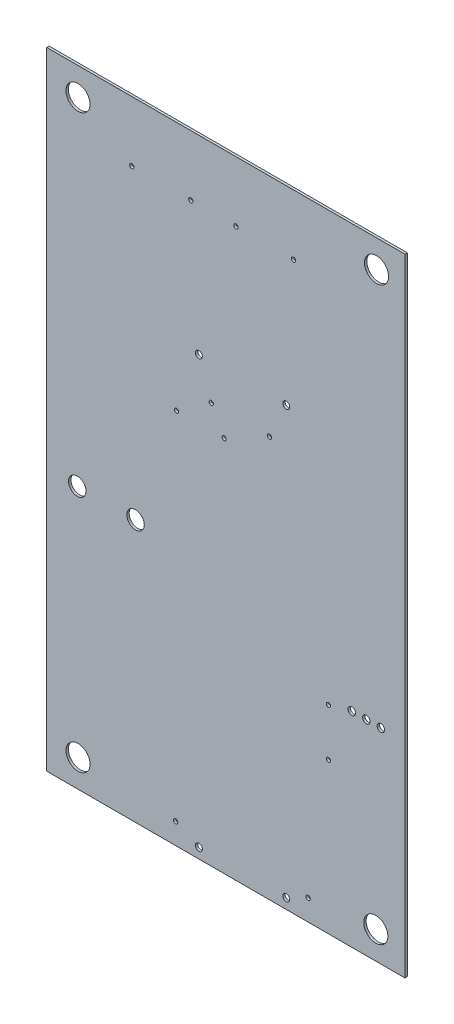
ISO-10303-21;
HEADER;
FILE_DESCRIPTION(('STEP AP214'),'2;1');
FILE_NAME('part.step','',(''),(''),'','','');
FILE_SCHEMA(('AUTOMOTIVE_DESIGN { 1 0 10303 214 1 1 1 1 }'));
ENDSEC;
DATA;
#1=APPLICATION_CONTEXT('core data for automotive mechanical design processes');
#2=APPLICATION_PROTOCOL_DEFINITION('international standard','automotive_design',2000,#1);
#3=PRODUCT_CONTEXT('',#1,'mechanical');
#4=PRODUCT('Part','Part','',(#3));
#5=PRODUCT_RELATED_PRODUCT_CATEGORY('part','',(#4));
#6=PRODUCT_DEFINITION_FORMATION('','',#4);
#7=PRODUCT_DEFINITION_CONTEXT('part definition',#1,'design');
#8=PRODUCT_DEFINITION('design','',#6,#7);
#9=PRODUCT_DEFINITION_SHAPE('','',#8);
#10=(LENGTH_UNIT() NAMED_UNIT(*) SI_UNIT(.MILLI.,.METRE.));
#11=(NAMED_UNIT(*) PLANE_ANGLE_UNIT() SI_UNIT($,.RADIAN.));
#12=(NAMED_UNIT(*) SI_UNIT($,.STERADIAN.) SOLID_ANGLE_UNIT());
#13=UNCERTAINTY_MEASURE_WITH_UNIT(LENGTH_MEASURE(1.E-05),#10,'distance_accuracy_value','');
#14=(GEOMETRIC_REPRESENTATION_CONTEXT(3) GLOBAL_UNCERTAINTY_ASSIGNED_CONTEXT((#13)) GLOBAL_UNIT_ASSIGNED_CONTEXT((#10,
#11,#12)) REPRESENTATION_CONTEXT('',''));
#15=CARTESIAN_POINT('',(0.,0.,0.));
#16=DIRECTION('',(0.,0.,1.));
#17=DIRECTION('',(1.,0.,0.));
#18=AXIS2_PLACEMENT_3D('',#15,#16,#17);
#19=CARTESIAN_POINT('',(57.276998519897,72.326499938965,0.41148));
#20=DIRECTION('',(0.,0.,1.));
#21=DIRECTION('',(1.,0.,0.));
#22=AXIS2_PLACEMENT_3D('',#19,#20,#21);
#23=PLANE('',#22);
#24=CARTESIAN_POINT('',(83.564,122.193,0.41148));
#25=DIRECTION('',(0.,0.,1.));
#26=DIRECTION('',(1.,0.,0.));
#27=AXIS2_PLACEMENT_3D('',#24,#25,#26);
#28=CIRCLE('',#27,2.1);
#29=CARTESIAN_POINT('',(85.664,122.193,0.41148));
#30=VERTEX_POINT('',#29);
#31=EDGE_CURVE('E27',#30,#30,#28,.T.);
#32=ORIENTED_EDGE('',*,*,#31,.F.);
#33=EDGE_LOOP('',(#32));
#34=FACE_BOUND('',#33,.T.);
#35=CARTESIAN_POINT('',(69.088,116.459,0.41148));
#36=DIRECTION('',(0.,0.,1.));
#37=DIRECTION('',(1.,0.,0.));
#38=AXIS2_PLACEMENT_3D('',#35,#36,#37);
#39=CIRCLE('',#38,0.381);
#40=CARTESIAN_POINT('',(69.469,116.459,0.41148));
#41=VERTEX_POINT('',#40);
#42=EDGE_CURVE('E314',#41,#41,#39,.T.);
#43=ORIENTED_EDGE('',*,*,#42,.F.);
#44=EDGE_LOOP('',(#43));
#45=FACE_BOUND('',#44,.T.);
#46=CARTESIAN_POINT('',(81.788,53.34,0.41148));
#47=DIRECTION('',(0.,0.,1.));
#48=DIRECTION('',(1.,0.,0.));
#49=AXIS2_PLACEMENT_3D('',#46,#47,#48);
#50=CIRCLE('',#49,0.65);
#51=CARTESIAN_POINT('',(82.438,53.34,0.41148));
#52=VERTEX_POINT('',#51);
#53=EDGE_CURVE('E308',#52,#52,#50,.T.);
#54=ORIENTED_EDGE('',*,*,#53,.F.);
#55=EDGE_LOOP('',(#54));
#56=FACE_BOUND('',#55,.T.);
#57=CARTESIAN_POINT('',(79.248,53.34,0.41148));
#58=DIRECTION('',(0.,0.,1.));
#59=DIRECTION('',(1.,0.,0.));
#60=AXIS2_PLACEMENT_3D('',#57,#58,#59);
#61=CIRCLE('',#60,0.65);
#62=CARTESIAN_POINT('',(79.898,53.34,0.41148));
#63=VERTEX_POINT('',#62);
#64=EDGE_CURVE('E223',#63,#63,#61,.T.);
#65=ORIENTED_EDGE('',*,*,#64,.F.);
#66=EDGE_LOOP('',(#65));
#67=FACE_BOUND('',#66,.T.);
#68=CARTESIAN_POINT('',(67.818,93.853,0.41148));
#69=DIRECTION('',(0.,0.,1.));
#70=DIRECTION('',(1.,0.,0.));
#71=AXIS2_PLACEMENT_3D('',#68,#69,#70);
#72=CIRCLE('',#71,0.61);
#73=CARTESIAN_POINT('',(68.428,93.853,0.41148));
#74=VERTEX_POINT('',#73);
#75=EDGE_CURVE('E289',#74,#74,#72,.T.);
#76=ORIENTED_EDGE('',*,*,#75,.F.);
#77=EDGE_LOOP('',(#76));
#78=FACE_BOUND('',#77,.T.);
#79=CARTESIAN_POINT('',(59.055,116.459,0.41148));
#80=DIRECTION('',(0.,0.,1.));
#81=DIRECTION('',(1.,0.,0.));
#82=AXIS2_PLACEMENT_3D('',#79,#80,#81);
#83=CIRCLE('',#82,0.381);
#84=CARTESIAN_POINT('',(59.436,116.459,0.41148));
#85=VERTEX_POINT('',#84);
#86=EDGE_CURVE('E206',#85,#85,#83,.T.);
#87=ORIENTED_EDGE('',*,*,#86,.F.);
#88=EDGE_LOOP('',(#87));
#89=FACE_BOUND('',#88,.T.);
#90=CARTESIAN_POINT('',(64.897,87.63,0.41148));
#91=DIRECTION('',(0.,0.,1.));
#92=DIRECTION('',(1.,0.,0.));
#93=AXIS2_PLACEMENT_3D('',#90,#91,#92);
#94=CIRCLE('',#93,0.381);
#95=CARTESIAN_POINT('',(65.278,87.63,0.41148));
#96=VERTEX_POINT('',#95);
#97=EDGE_CURVE('E296',#96,#96,#94,.T.);
#98=ORIENTED_EDGE('',*,*,#97,.F.);
#99=EDGE_LOOP('',(#98));
#100=FACE_BOUND('',#99,.T.);
#101=CARTESIAN_POINT('',(84.328,53.34,0.41148));
#102=DIRECTION('',(0.,0.,1.));
#103=DIRECTION('',(1.,0.,0.));
#104=AXIS2_PLACEMENT_3D('',#101,#102,#103);
#105=CIRCLE('',#104,0.65);
#106=CARTESIAN_POINT('',(84.978,53.34,0.41148));
#107=VERTEX_POINT('',#106);
#108=EDGE_CURVE('E275',#107,#107,#105,.T.);
#109=ORIENTED_EDGE('',*,*,#108,.F.);
#110=EDGE_LOOP('',(#109));
#111=FACE_BOUND('',#110,.T.);
#112=CARTESIAN_POINT('',(75.184,52.234,0.41148));
#113=DIRECTION('',(0.,0.,1.));
#114=DIRECTION('',(1.,0.,0.));
#115=AXIS2_PLACEMENT_3D('',#112,#113,#114);
#116=CIRCLE('',#115,0.365);
#117=CARTESIAN_POINT('',(75.549,52.234,0.41148));
#118=VERTEX_POINT('',#117);
#119=EDGE_CURVE('E274',#118,#118,#116,.T.);
#120=ORIENTED_EDGE('',*,*,#119,.F.);
#121=EDGE_LOOP('',(#120));
#122=FACE_BOUND('',#121,.T.);
#123=CARTESIAN_POINT('',(83.439,22.479,0.41148));
#124=DIRECTION('',(0.,0.,1.));
#125=DIRECTION('',(1.,0.,0.));
#126=AXIS2_PLACEMENT_3D('',#123,#124,#125);
#127=CIRCLE('',#126,2.1);
#128=CARTESIAN_POINT('',(85.539,22.479,0.41148));
#129=VERTEX_POINT('',#128);
#130=EDGE_CURVE('E236',#129,#129,#127,.T.);
#131=ORIENTED_EDGE('',*,*,#130,.F.);
#132=EDGE_LOOP('',(#131));
#133=FACE_BOUND('',#132,.T.);
#134=CARTESIAN_POINT('',(75.184,43.942,0.41148));
#135=DIRECTION('',(0.,0.,1.));
#136=DIRECTION('',(1.,0.,0.));
#137=AXIS2_PLACEMENT_3D('',#134,#135,#136);
#138=CIRCLE('',#137,0.365);
#139=CARTESIAN_POINT('',(75.549,43.942,0.41148));
#140=VERTEX_POINT('',#139);
#141=EDGE_CURVE('E362',#140,#140,#138,.T.);
#142=ORIENTED_EDGE('',*,*,#141,.F.);
#143=EDGE_LOOP('',(#142));
#144=FACE_BOUND('',#143,.T.);
#145=CARTESIAN_POINT('',(71.628,21.336,0.41148));
#146=DIRECTION('',(0.,0.,1.));
#147=DIRECTION('',(1.,0.,0.));
#148=AXIS2_PLACEMENT_3D('',#145,#146,#147);
#149=CIRCLE('',#148,0.381);
#150=CARTESIAN_POINT('',(72.009,21.336,0.41148));
#151=VERTEX_POINT('',#150);
#152=EDGE_CURVE('E211',#151,#151,#149,.T.);
#153=ORIENTED_EDGE('',*,*,#152,.F.);
#154=EDGE_LOOP('',(#153));
#155=FACE_BOUND('',#154,.T.);
#156=CARTESIAN_POINT('',(67.818,19.431,0.41148));
#157=DIRECTION('',(0.,0.,1.));
#158=DIRECTION('',(1.,0.,0.));
#159=AXIS2_PLACEMENT_3D('',#156,#157,#158);
#160=CIRCLE('',#159,0.61);
#161=CARTESIAN_POINT('',(68.428,19.431,0.41148));
#162=VERTEX_POINT('',#161);
#163=EDGE_CURVE('E224',#162,#162,#160,.T.);
#164=ORIENTED_EDGE('',*,*,#163,.F.);
#165=EDGE_LOOP('',(#164));
#166=FACE_BOUND('',#165,.T.);
#167=CARTESIAN_POINT('',(54.737,87.63,0.41148));
#168=DIRECTION('',(0.,0.,1.));
#169=DIRECTION('',(1.,0.,0.));
#170=AXIS2_PLACEMENT_3D('',#167,#168,#169);
#171=CIRCLE('',#170,0.381);
#172=CARTESIAN_POINT('',(55.118,87.63,0.41148));
#173=VERTEX_POINT('',#172);
#174=EDGE_CURVE('E294',#173,#173,#171,.T.);
#175=ORIENTED_EDGE('',*,*,#174,.F.);
#176=EDGE_LOOP('',(#175));
#177=FACE_BOUND('',#176,.T.);
#178=CARTESIAN_POINT('',(52.578,93.853,0.41148));
#179=DIRECTION('',(0.,0.,1.));
#180=DIRECTION('',(1.,0.,0.));
#181=AXIS2_PLACEMENT_3D('',#178,#179,#180);
#182=CIRCLE('',#181,0.61);
#183=CARTESIAN_POINT('',(53.188,93.853,0.41148));
#184=VERTEX_POINT('',#183);
#185=EDGE_CURVE('E246',#184,#184,#182,.T.);
#186=ORIENTED_EDGE('',*,*,#185,.F.);
#187=EDGE_LOOP('',(#186));
#188=FACE_BOUND('',#187,.T.);
#189=CARTESIAN_POINT('',(56.978,83.439,0.41148));
#190=DIRECTION('',(0.,0.,1.));
#191=DIRECTION('',(1.,0.,0.));
#192=AXIS2_PLACEMENT_3D('',#189,#190,#191);
#193=CIRCLE('',#192,0.365);
#194=CARTESIAN_POINT('',(57.343,83.439,0.41148));
#195=VERTEX_POINT('',#194);
#196=EDGE_CURVE('E253',#195,#195,#193,.T.);
#197=ORIENTED_EDGE('',*,*,#196,.F.);
#198=EDGE_LOOP('',(#197));
#199=FACE_BOUND('',#198,.T.);
#200=CARTESIAN_POINT('',(40.894,116.459,0.41148));
#201=DIRECTION('',(0.,0.,1.));
#202=DIRECTION('',(1.,0.,0.));
#203=AXIS2_PLACEMENT_3D('',#200,#201,#202);
#204=CIRCLE('',#203,0.381);
#205=CARTESIAN_POINT('',(41.275,116.459,0.41148));
#206=VERTEX_POINT('',#205);
#207=EDGE_CURVE('E187',#206,#206,#204,.T.);
#208=ORIENTED_EDGE('',*,*,#207,.F.);
#209=EDGE_LOOP('',(#208));
#210=FACE_BOUND('',#209,.T.);
#211=CARTESIAN_POINT('',(31.496,122.174,0.41148));
#212=DIRECTION('',(0.,0.,1.));
#213=DIRECTION('',(1.,0.,0.));
#214=AXIS2_PLACEMENT_3D('',#211,#212,#213);
#215=CIRCLE('',#214,2.1);
#216=CARTESIAN_POINT('',(33.596,122.174,0.41148));
#217=VERTEX_POINT('',#216);
#218=EDGE_CURVE('E372',#217,#217,#215,.T.);
#219=ORIENTED_EDGE('',*,*,#218,.F.);
#220=EDGE_LOOP('',(#219));
#221=FACE_BOUND('',#220,.T.);
#222=CARTESIAN_POINT('',(51.181,116.459,0.41148));
#223=DIRECTION('',(0.,0.,1.));
#224=DIRECTION('',(1.,0.,0.));
#225=AXIS2_PLACEMENT_3D('',#222,#223,#224);
#226=CIRCLE('',#225,0.381);
#227=CARTESIAN_POINT('',(51.562,116.459,0.41148));
#228=VERTEX_POINT('',#227);
#229=EDGE_CURVE('E382',#228,#228,#226,.T.);
#230=ORIENTED_EDGE('',*,*,#229,.F.);
#231=EDGE_LOOP('',(#230));
#232=FACE_BOUND('',#231,.T.);
#233=CARTESIAN_POINT('',(48.686,83.439,0.41148));
#234=DIRECTION('',(0.,0.,1.));
#235=DIRECTION('',(1.,0.,0.));
#236=AXIS2_PLACEMENT_3D('',#233,#234,#235);
#237=CIRCLE('',#236,0.365);
#238=CARTESIAN_POINT('',(49.051,83.439,0.41148));
#239=VERTEX_POINT('',#238);
#240=EDGE_CURVE('E263',#239,#239,#237,.T.);
#241=ORIENTED_EDGE('',*,*,#240,.F.);
#242=EDGE_LOOP('',(#241));
#243=FACE_BOUND('',#242,.T.);
#244=CARTESIAN_POINT('',(48.514,21.336,0.41148));
#245=DIRECTION('',(0.,0.,1.));
#246=DIRECTION('',(1.,0.,0.));
#247=AXIS2_PLACEMENT_3D('',#244,#245,#246);
#248=CIRCLE('',#247,0.381);
#249=CARTESIAN_POINT('',(48.895,21.336,0.41148));
#250=VERTEX_POINT('',#249);
#251=EDGE_CURVE('E325',#250,#250,#248,.T.);
#252=ORIENTED_EDGE('',*,*,#251,.F.);
#253=EDGE_LOOP('',(#252));
#254=FACE_BOUND('',#253,.T.);
#255=CARTESIAN_POINT('',(52.578,19.431,0.41148));
#256=DIRECTION('',(0.,0.,1.));
#257=DIRECTION('',(1.,0.,0.));
#258=AXIS2_PLACEMENT_3D('',#255,#256,#257);
#259=CIRCLE('',#258,0.61);
#260=CARTESIAN_POINT('',(53.188,19.431,0.41148));
#261=VERTEX_POINT('',#260);
#262=EDGE_CURVE('E340',#261,#261,#259,.T.);
#263=ORIENTED_EDGE('',*,*,#262,.F.);
#264=EDGE_LOOP('',(#263));
#265=FACE_BOUND('',#264,.T.);
#266=CARTESIAN_POINT('',(41.529,63.373,0.41148));
#267=DIRECTION('',(0.,0.,1.));
#268=DIRECTION('',(1.,0.,0.));
#269=AXIS2_PLACEMENT_3D('',#266,#267,#268);
#270=CIRCLE('',#269,1.524);
#271=CARTESIAN_POINT('',(43.053,63.373,0.41148));
#272=VERTEX_POINT('',#271);
#273=EDGE_CURVE('E241',#272,#272,#270,.T.);
#274=ORIENTED_EDGE('',*,*,#273,.F.);
#275=EDGE_LOOP('',(#274));
#276=FACE_BOUND('',#275,.T.);
#277=CARTESIAN_POINT('',(31.369,63.373,0.41148));
#278=DIRECTION('',(0.,0.,1.));
#279=DIRECTION('',(1.,0.,0.));
#280=AXIS2_PLACEMENT_3D('',#277,#278,#279);
#281=CIRCLE('',#280,1.524);
#282=CARTESIAN_POINT('',(32.893,63.373,0.41148));
#283=VERTEX_POINT('',#282);
#284=EDGE_CURVE('E212',#283,#283,#281,.T.);
#285=ORIENTED_EDGE('',*,*,#284,.F.);
#286=EDGE_LOOP('',(#285));
#287=FACE_BOUND('',#286,.T.);
#288=CARTESIAN_POINT('',(31.496,22.479,0.41148));
#289=DIRECTION('',(0.,0.,1.));
#290=DIRECTION('',(1.,0.,0.));
#291=AXIS2_PLACEMENT_3D('',#288,#289,#290);
#292=CIRCLE('',#291,2.1);
#293=CARTESIAN_POINT('',(33.596,22.479,0.41148));
#294=VERTEX_POINT('',#293);
#295=EDGE_CURVE('E439',#294,#294,#292,.T.);
#296=ORIENTED_EDGE('',*,*,#295,.F.);
#297=EDGE_LOOP('',(#296));
#298=FACE_BOUND('',#297,.T.);
#299=DIRECTION('',(1.,0.,0.));
#300=VECTOR('',#299,1.);
#301=CARTESIAN_POINT('',(26.034999847412,17.65299987793,0.41148));
#302=LINE('',#301,#300);
#303=CARTESIAN_POINT('',(26.034999847412,17.65299987793,0.41148));
#304=VERTEX_POINT('',#303);
#305=CARTESIAN_POINT('',(88.518997192383,17.65299987793,0.41148));
#306=VERTEX_POINT('',#305);
#307=EDGE_CURVE('E396',#304,#306,#302,.T.);
#308=ORIENTED_EDGE('',*,*,#307,.T.);
#309=DIRECTION('',(0.,1.,0.));
#310=VECTOR('',#309,1.);
#311=CARTESIAN_POINT('',(88.518997192383,17.65299987793,0.41148));
#312=LINE('',#311,#310);
#313=CARTESIAN_POINT('',(88.518997192383,127.,0.41148));
#314=VERTEX_POINT('',#313);
#315=EDGE_CURVE('E357',#306,#314,#312,.T.);
#316=ORIENTED_EDGE('',*,*,#315,.T.);
#317=DIRECTION('',(-1.,0.,0.));
#318=VECTOR('',#317,1.);
#319=CARTESIAN_POINT('',(88.518997192383,127.,0.41148));
#320=LINE('',#319,#318);
#321=CARTESIAN_POINT('',(26.034999847412,127.,0.41148));
#322=VERTEX_POINT('',#321);
#323=EDGE_CURVE('E257',#314,#322,#320,.T.);
#324=ORIENTED_EDGE('',*,*,#323,.T.);
#325=DIRECTION('',(0.,-1.,0.));
#326=VECTOR('',#325,1.);
#327=CARTESIAN_POINT('',(26.034999847412,127.,0.41148));
#328=LINE('',#327,#326);
#329=EDGE_CURVE('E352',#322,#304,#328,.T.);
#330=ORIENTED_EDGE('',*,*,#329,.T.);
#331=EDGE_LOOP('',(#308,#316,#324,#330));
#332=FACE_BOUND('',#331,.T.);
#333=ADVANCED_FACE('F16',(#34,#45,#56,#67,#78,#89,#100,#111,#122,#133,#144,#155,#166,#177,#188,
#199,#210,#221,#232,#243,#254,#265,#276,#287,#298,#332),#23,.T.);
#334=CARTESIAN_POINT('',(57.276998519897,72.326499938965,0.));
#335=DIRECTION('',(0.,0.,1.));
#336=DIRECTION('',(1.,0.,0.));
#337=AXIS2_PLACEMENT_3D('',#334,#335,#336);
#338=PLANE('',#337);
#339=CARTESIAN_POINT('',(83.564,122.193,0.));
#340=DIRECTION('',(0.,0.,1.));
#341=DIRECTION('',(1.,0.,0.));
#342=AXIS2_PLACEMENT_3D('',#339,#340,#341);
#343=CIRCLE('',#342,2.1);
#344=CARTESIAN_POINT('',(85.664,122.193,0.));
#345=VERTEX_POINT('',#344);
#346=EDGE_CURVE('E11',#345,#345,#343,.T.);
#347=ORIENTED_EDGE('',*,*,#346,.T.);
#348=EDGE_LOOP('',(#347));
#349=FACE_BOUND('',#348,.T.);
#350=CARTESIAN_POINT('',(69.088,116.459,0.));
#351=DIRECTION('',(0.,0.,1.));
#352=DIRECTION('',(1.,0.,0.));
#353=AXIS2_PLACEMENT_3D('',#350,#351,#352);
#354=CIRCLE('',#353,0.381);
#355=CARTESIAN_POINT('',(69.469,116.459,0.));
#356=VERTEX_POINT('',#355);
#357=EDGE_CURVE('E321',#356,#356,#354,.T.);
#358=ORIENTED_EDGE('',*,*,#357,.T.);
#359=EDGE_LOOP('',(#358));
#360=FACE_BOUND('',#359,.T.);
#361=CARTESIAN_POINT('',(81.788,53.34,0.));
#362=DIRECTION('',(0.,0.,1.));
#363=DIRECTION('',(1.,0.,0.));
#364=AXIS2_PLACEMENT_3D('',#361,#362,#363);
#365=CIRCLE('',#364,0.65);
#366=CARTESIAN_POINT('',(82.438,53.34,0.));
#367=VERTEX_POINT('',#366);
#368=EDGE_CURVE('E315',#367,#367,#365,.T.);
#369=ORIENTED_EDGE('',*,*,#368,.T.);
#370=EDGE_LOOP('',(#369));
#371=FACE_BOUND('',#370,.T.);
#372=CARTESIAN_POINT('',(79.248,53.34,0.));
#373=DIRECTION('',(0.,0.,1.));
#374=DIRECTION('',(1.,0.,0.));
#375=AXIS2_PLACEMENT_3D('',#372,#373,#374);
#376=CIRCLE('',#375,0.65);
#377=CARTESIAN_POINT('',(79.898,53.34,0.));
#378=VERTEX_POINT('',#377);
#379=EDGE_CURVE('E218',#378,#378,#376,.T.);
#380=ORIENTED_EDGE('',*,*,#379,.T.);
#381=EDGE_LOOP('',(#380));
#382=FACE_BOUND('',#381,.T.);
#383=CARTESIAN_POINT('',(67.818,93.853,0.));
#384=DIRECTION('',(0.,0.,1.));
#385=DIRECTION('',(1.,0.,0.));
#386=AXIS2_PLACEMENT_3D('',#383,#384,#385);
#387=CIRCLE('',#386,0.61);
#388=CARTESIAN_POINT('',(68.428,93.853,0.));
#389=VERTEX_POINT('',#388);
#390=EDGE_CURVE('E284',#389,#389,#387,.T.);
#391=ORIENTED_EDGE('',*,*,#390,.T.);
#392=EDGE_LOOP('',(#391));
#393=FACE_BOUND('',#392,.T.);
#394=CARTESIAN_POINT('',(59.055,116.459,0.));
#395=DIRECTION('',(0.,0.,1.));
#396=DIRECTION('',(1.,0.,0.));
#397=AXIS2_PLACEMENT_3D('',#394,#395,#396);
#398=CIRCLE('',#397,0.381);
#399=CARTESIAN_POINT('',(59.436,116.459,0.));
#400=VERTEX_POINT('',#399);
#401=EDGE_CURVE('E388',#400,#400,#398,.T.);
#402=ORIENTED_EDGE('',*,*,#401,.T.);
#403=EDGE_LOOP('',(#402));
#404=FACE_BOUND('',#403,.T.);
#405=CARTESIAN_POINT('',(64.897,87.63,0.));
#406=DIRECTION('',(0.,0.,1.));
#407=DIRECTION('',(1.,0.,0.));
#408=AXIS2_PLACEMENT_3D('',#405,#406,#407);
#409=CIRCLE('',#408,0.381);
#410=CARTESIAN_POINT('',(65.278,87.63,0.));
#411=VERTEX_POINT('',#410);
#412=EDGE_CURVE('E300',#411,#411,#409,.T.);
#413=ORIENTED_EDGE('',*,*,#412,.T.);
#414=EDGE_LOOP('',(#413));
#415=FACE_BOUND('',#414,.T.);
#416=CARTESIAN_POINT('',(84.328,53.34,0.));
#417=DIRECTION('',(0.,0.,1.));
#418=DIRECTION('',(1.,0.,0.));
#419=AXIS2_PLACEMENT_3D('',#416,#417,#418);
#420=CIRCLE('',#419,0.65);
#421=CARTESIAN_POINT('',(84.978,53.34,0.));
#422=VERTEX_POINT('',#421);
#423=EDGE_CURVE('E279',#422,#422,#420,.T.);
#424=ORIENTED_EDGE('',*,*,#423,.T.);
#425=EDGE_LOOP('',(#424));
#426=FACE_BOUND('',#425,.T.);
#427=CARTESIAN_POINT('',(75.184,52.234,0.));
#428=DIRECTION('',(0.,0.,1.));
#429=DIRECTION('',(1.,0.,0.));
#430=AXIS2_PLACEMENT_3D('',#427,#428,#429);
#431=CIRCLE('',#430,0.365);
#432=CARTESIAN_POINT('',(75.549,52.234,0.));
#433=VERTEX_POINT('',#432);
#434=EDGE_CURVE('E271',#433,#433,#431,.T.);
#435=ORIENTED_EDGE('',*,*,#434,.T.);
#436=EDGE_LOOP('',(#435));
#437=FACE_BOUND('',#436,.T.);
#438=CARTESIAN_POINT('',(83.439,22.479,0.));
#439=DIRECTION('',(0.,0.,1.));
#440=DIRECTION('',(1.,0.,0.));
#441=AXIS2_PLACEMENT_3D('',#438,#439,#440);
#442=CIRCLE('',#441,2.1);
#443=CARTESIAN_POINT('',(85.539,22.479,0.));
#444=VERTEX_POINT('',#443);
#445=EDGE_CURVE('E232',#444,#444,#442,.T.);
#446=ORIENTED_EDGE('',*,*,#445,.T.);
#447=EDGE_LOOP('',(#446));
#448=FACE_BOUND('',#447,.T.);
#449=CARTESIAN_POINT('',(75.184,43.942,0.));
#450=DIRECTION('',(0.,0.,1.));
#451=DIRECTION('',(1.,0.,0.));
#452=AXIS2_PLACEMENT_3D('',#449,#450,#451);
#453=CIRCLE('',#452,0.365);
#454=CARTESIAN_POINT('',(75.549,43.942,0.));
#455=VERTEX_POINT('',#454);
#456=EDGE_CURVE('E252',#455,#455,#453,.T.);
#457=ORIENTED_EDGE('',*,*,#456,.T.);
#458=EDGE_LOOP('',(#457));
#459=FACE_BOUND('',#458,.T.);
#460=CARTESIAN_POINT('',(71.628,21.336,0.));
#461=DIRECTION('',(0.,0.,1.));
#462=DIRECTION('',(1.,0.,0.));
#463=AXIS2_PLACEMENT_3D('',#460,#461,#462);
#464=CIRCLE('',#463,0.381);
#465=CARTESIAN_POINT('',(72.009,21.336,0.));
#466=VERTEX_POINT('',#465);
#467=EDGE_CURVE('E208',#466,#466,#464,.T.);
#468=ORIENTED_EDGE('',*,*,#467,.T.);
#469=EDGE_LOOP('',(#468));
#470=FACE_BOUND('',#469,.T.);
#471=CARTESIAN_POINT('',(67.818,19.431,0.));
#472=DIRECTION('',(0.,0.,1.));
#473=DIRECTION('',(1.,0.,0.));
#474=AXIS2_PLACEMENT_3D('',#471,#472,#473);
#475=CIRCLE('',#474,0.61);
#476=CARTESIAN_POINT('',(68.428,19.431,0.));
#477=VERTEX_POINT('',#476);
#478=EDGE_CURVE('E227',#477,#477,#475,.T.);
#479=ORIENTED_EDGE('',*,*,#478,.T.);
#480=EDGE_LOOP('',(#479));
#481=FACE_BOUND('',#480,.T.);
#482=CARTESIAN_POINT('',(54.737,87.63,0.));
#483=DIRECTION('',(0.,0.,1.));
#484=DIRECTION('',(1.,0.,0.));
#485=AXIS2_PLACEMENT_3D('',#482,#483,#484);
#486=CIRCLE('',#485,0.381);
#487=CARTESIAN_POINT('',(55.118,87.63,0.));
#488=VERTEX_POINT('',#487);
#489=EDGE_CURVE('E320',#488,#488,#486,.T.);
#490=ORIENTED_EDGE('',*,*,#489,.T.);
#491=EDGE_LOOP('',(#490));
#492=FACE_BOUND('',#491,.T.);
#493=CARTESIAN_POINT('',(52.578,93.853,0.));
#494=DIRECTION('',(0.,0.,1.));
#495=DIRECTION('',(1.,0.,0.));
#496=AXIS2_PLACEMENT_3D('',#493,#494,#495);
#497=CIRCLE('',#496,0.61);
#498=CARTESIAN_POINT('',(53.188,93.853,0.));
#499=VERTEX_POINT('',#498);
#500=EDGE_CURVE('E295',#499,#499,#497,.T.);
#501=ORIENTED_EDGE('',*,*,#500,.T.);
#502=EDGE_LOOP('',(#501));
#503=FACE_BOUND('',#502,.T.);
#504=CARTESIAN_POINT('',(56.978,83.439,0.));
#505=DIRECTION('',(0.,0.,1.));
#506=DIRECTION('',(1.,0.,0.));
#507=AXIS2_PLACEMENT_3D('',#504,#505,#506);
#508=CIRCLE('',#507,0.365);
#509=CARTESIAN_POINT('',(57.343,83.439,0.));
#510=VERTEX_POINT('',#509);
#511=EDGE_CURVE('E247',#510,#510,#508,.T.);
#512=ORIENTED_EDGE('',*,*,#511,.T.);
#513=EDGE_LOOP('',(#512));
#514=FACE_BOUND('',#513,.T.);
#515=CARTESIAN_POINT('',(40.894,116.459,0.));
#516=DIRECTION('',(0.,0.,1.));
#517=DIRECTION('',(1.,0.,0.));
#518=AXIS2_PLACEMENT_3D('',#515,#516,#517);
#519=CIRCLE('',#518,0.381);
#520=CARTESIAN_POINT('',(41.275,116.459,0.));
#521=VERTEX_POINT('',#520);
#522=EDGE_CURVE('E193',#521,#521,#519,.T.);
#523=ORIENTED_EDGE('',*,*,#522,.T.);
#524=EDGE_LOOP('',(#523));
#525=FACE_BOUND('',#524,.T.);
#526=CARTESIAN_POINT('',(31.496,122.174,0.));
#527=DIRECTION('',(0.,0.,1.));
#528=DIRECTION('',(1.,0.,0.));
#529=AXIS2_PLACEMENT_3D('',#526,#527,#528);
#530=CIRCLE('',#529,2.1);
#531=CARTESIAN_POINT('',(33.596,122.174,0.));
#532=VERTEX_POINT('',#531);
#533=EDGE_CURVE('E202',#532,#532,#530,.T.);
#534=ORIENTED_EDGE('',*,*,#533,.T.);
#535=EDGE_LOOP('',(#534));
#536=FACE_BOUND('',#535,.T.);
#537=CARTESIAN_POINT('',(51.181,116.459,0.));
#538=DIRECTION('',(0.,0.,1.));
#539=DIRECTION('',(1.,0.,0.));
#540=AXIS2_PLACEMENT_3D('',#537,#538,#539);
#541=CIRCLE('',#540,0.381);
#542=CARTESIAN_POINT('',(51.562,116.459,0.));
#543=VERTEX_POINT('',#542);
#544=EDGE_CURVE('E379',#543,#543,#541,.T.);
#545=ORIENTED_EDGE('',*,*,#544,.T.);
#546=EDGE_LOOP('',(#545));
#547=FACE_BOUND('',#546,.T.);
#548=CARTESIAN_POINT('',(48.686,83.439,0.));
#549=DIRECTION('',(0.,0.,1.));
#550=DIRECTION('',(1.,0.,0.));
#551=AXIS2_PLACEMENT_3D('',#548,#549,#550);
#552=CIRCLE('',#551,0.365);
#553=CARTESIAN_POINT('',(49.051,83.439,0.));
#554=VERTEX_POINT('',#553);
#555=EDGE_CURVE('E266',#554,#554,#552,.T.);
#556=ORIENTED_EDGE('',*,*,#555,.T.);
#557=EDGE_LOOP('',(#556));
#558=FACE_BOUND('',#557,.T.);
#559=CARTESIAN_POINT('',(48.514,21.336,0.));
#560=DIRECTION('',(0.,0.,1.));
#561=DIRECTION('',(1.,0.,0.));
#562=AXIS2_PLACEMENT_3D('',#559,#560,#561);
#563=CIRCLE('',#562,0.381);
#564=CARTESIAN_POINT('',(48.895,21.336,0.));
#565=VERTEX_POINT('',#564);
#566=EDGE_CURVE('E329',#565,#565,#563,.T.);
#567=ORIENTED_EDGE('',*,*,#566,.T.);
#568=EDGE_LOOP('',(#567));
#569=FACE_BOUND('',#568,.T.);
#570=CARTESIAN_POINT('',(52.578,19.431,0.));
#571=DIRECTION('',(0.,0.,1.));
#572=DIRECTION('',(1.,0.,0.));
#573=AXIS2_PLACEMENT_3D('',#570,#571,#572);
#574=CIRCLE('',#573,0.61);
#575=CARTESIAN_POINT('',(53.188,19.431,0.));
#576=VERTEX_POINT('',#575);
#577=EDGE_CURVE('E334',#576,#576,#574,.T.);
#578=ORIENTED_EDGE('',*,*,#577,.T.);
#579=EDGE_LOOP('',(#578));
#580=FACE_BOUND('',#579,.T.);
#581=CARTESIAN_POINT('',(41.529,63.373,0.));
#582=DIRECTION('',(0.,0.,1.));
#583=DIRECTION('',(1.,0.,0.));
#584=AXIS2_PLACEMENT_3D('',#581,#582,#583);
#585=CIRCLE('',#584,1.524);
#586=CARTESIAN_POINT('',(43.053,63.373,0.));
#587=VERTEX_POINT('',#586);
#588=EDGE_CURVE('E415',#587,#587,#585,.T.);
#589=ORIENTED_EDGE('',*,*,#588,.T.);
#590=EDGE_LOOP('',(#589));
#591=FACE_BOUND('',#590,.T.);
#592=CARTESIAN_POINT('',(31.369,63.373,0.));
#593=DIRECTION('',(0.,0.,1.));
#594=DIRECTION('',(1.,0.,0.));
#595=AXIS2_PLACEMENT_3D('',#592,#593,#594);
#596=CIRCLE('',#595,1.524);
#597=CARTESIAN_POINT('',(32.893,63.373,0.));
#598=VERTEX_POINT('',#597);
#599=EDGE_CURVE('E216',#598,#598,#596,.T.);
#600=ORIENTED_EDGE('',*,*,#599,.T.);
#601=EDGE_LOOP('',(#600));
#602=FACE_BOUND('',#601,.T.);
#603=CARTESIAN_POINT('',(31.496,22.479,0.));
#604=DIRECTION('',(0.,0.,1.));
#605=DIRECTION('',(1.,0.,0.));
#606=AXIS2_PLACEMENT_3D('',#603,#604,#605);
#607=CIRCLE('',#606,2.1);
#608=CARTESIAN_POINT('',(33.596,22.479,0.));
#609=VERTEX_POINT('',#608);
#610=EDGE_CURVE('E436',#609,#609,#607,.T.);
#611=ORIENTED_EDGE('',*,*,#610,.T.);
#612=EDGE_LOOP('',(#611));
#613=FACE_BOUND('',#612,.T.);
#614=DIRECTION('',(0.,-1.,0.));
#615=VECTOR('',#614,1.);
#616=CARTESIAN_POINT('',(26.034999847412,127.,0.));
#617=LINE('',#616,#615);
#618=CARTESIAN_POINT('',(26.034999847412,127.,0.));
#619=VERTEX_POINT('',#618);
#620=CARTESIAN_POINT('',(26.034999847412,17.65299987793,0.));
#621=VERTEX_POINT('',#620);
#622=EDGE_CURVE('E261',#619,#621,#617,.T.);
#623=ORIENTED_EDGE('',*,*,#622,.F.);
#624=DIRECTION('',(-1.,0.,0.));
#625=VECTOR('',#624,1.);
#626=CARTESIAN_POINT('',(88.518997192383,127.,0.));
#627=LINE('',#626,#625);
#628=CARTESIAN_POINT('',(88.518997192383,127.,0.));
#629=VERTEX_POINT('',#628);
#630=EDGE_CURVE('E283',#629,#619,#627,.T.);
#631=ORIENTED_EDGE('',*,*,#630,.F.);
#632=DIRECTION('',(0.,1.,0.));
#633=VECTOR('',#632,1.);
#634=CARTESIAN_POINT('',(88.518997192383,17.65299987793,0.));
#635=LINE('',#634,#633);
#636=CARTESIAN_POINT('',(88.518997192383,17.65299987793,0.));
#637=VERTEX_POINT('',#636);
#638=EDGE_CURVE('E358',#637,#629,#635,.T.);
#639=ORIENTED_EDGE('',*,*,#638,.F.);
#640=DIRECTION('',(1.,0.,0.));
#641=VECTOR('',#640,1.);
#642=CARTESIAN_POINT('',(26.034999847412,17.65299987793,0.));
#643=LINE('',#642,#641);
#644=EDGE_CURVE('E397',#621,#637,#643,.T.);
#645=ORIENTED_EDGE('',*,*,#644,.F.);
#646=EDGE_LOOP('',(#623,#631,#639,#645));
#647=FACE_BOUND('',#646,.T.);
#648=ADVANCED_FACE('F526',(#349,#360,#371,#382,#393,#404,#415,#426,#437,#448,#459,#470,#481,
#492,#503,#514,#525,#536,#547,#558,#569,#580,#591,#602,#613,#647),#338,.F.);
#649=CARTESIAN_POINT('',(83.564,122.193,0.));
#650=DIRECTION('',(0.,0.,-1.));
#651=DIRECTION('',(1.,0.,0.));
#652=AXIS2_PLACEMENT_3D('',#649,#650,#651);
#653=CYLINDRICAL_SURFACE('',#652,2.1);
#654=DIRECTION('',(0.,0.,1.));
#655=VECTOR('',#654,1.);
#656=CARTESIAN_POINT('',(85.664,122.193,0.));
#657=LINE('',#656,#655);
#658=EDGE_CURVE('E324',#345,#30,#657,.T.);
#659=ORIENTED_EDGE('',*,*,#658,.T.);
#660=ORIENTED_EDGE('',*,*,#31,.T.);
#661=ORIENTED_EDGE('',*,*,#658,.F.);
#662=ORIENTED_EDGE('',*,*,#346,.F.);
#663=EDGE_LOOP('',(#659,#660,#661,#662));
#664=FACE_BOUND('',#663,.T.);
#665=ADVANCED_FACE('F664',(#664),#653,.F.);
#666=CARTESIAN_POINT('',(69.088,116.459,0.));
#667=DIRECTION('',(0.,0.,-1.));
#668=DIRECTION('',(1.,0.,0.));
#669=AXIS2_PLACEMENT_3D('',#666,#667,#668);
#670=CYLINDRICAL_SURFACE('',#669,0.381);
#671=DIRECTION('',(0.,0.,1.));
#672=VECTOR('',#671,1.);
#673=CARTESIAN_POINT('',(69.469,116.459,0.));
#674=LINE('',#673,#672);
#675=EDGE_CURVE('E311',#356,#41,#674,.T.);
#676=ORIENTED_EDGE('',*,*,#675,.T.);
#677=ORIENTED_EDGE('',*,*,#42,.T.);
#678=ORIENTED_EDGE('',*,*,#675,.F.);
#679=ORIENTED_EDGE('',*,*,#357,.F.);
#680=EDGE_LOOP('',(#676,#677,#678,#679));
#681=FACE_BOUND('',#680,.T.);
#682=ADVANCED_FACE('F741',(#681),#670,.F.);
#683=CARTESIAN_POINT('',(81.788,53.34,0.));
#684=DIRECTION('',(0.,0.,-1.));
#685=DIRECTION('',(1.,0.,0.));
#686=AXIS2_PLACEMENT_3D('',#683,#684,#685);
#687=CYLINDRICAL_SURFACE('',#686,0.65);
#688=DIRECTION('',(0.,0.,1.));
#689=VECTOR('',#688,1.);
#690=CARTESIAN_POINT('',(82.438,53.34,0.));
#691=LINE('',#690,#689);
#692=EDGE_CURVE('E222',#367,#52,#691,.T.);
#693=ORIENTED_EDGE('',*,*,#692,.T.);
#694=ORIENTED_EDGE('',*,*,#53,.T.);
#695=ORIENTED_EDGE('',*,*,#692,.F.);
#696=ORIENTED_EDGE('',*,*,#368,.F.);
#697=EDGE_LOOP('',(#693,#694,#695,#696));
#698=FACE_BOUND('',#697,.T.);
#699=ADVANCED_FACE('F671',(#698),#687,.F.);
#700=CARTESIAN_POINT('',(79.248,53.34,0.));
#701=DIRECTION('',(0.,0.,-1.));
#702=DIRECTION('',(1.,0.,0.));
#703=AXIS2_PLACEMENT_3D('',#700,#701,#702);
#704=CYLINDRICAL_SURFACE('',#703,0.65);
#705=DIRECTION('',(0.,0.,1.));
#706=VECTOR('',#705,1.);
#707=CARTESIAN_POINT('',(79.898,53.34,0.));
#708=LINE('',#707,#706);
#709=EDGE_CURVE('E288',#378,#63,#708,.T.);
#710=ORIENTED_EDGE('',*,*,#709,.T.);
#711=ORIENTED_EDGE('',*,*,#64,.T.);
#712=ORIENTED_EDGE('',*,*,#709,.F.);
#713=ORIENTED_EDGE('',*,*,#379,.F.);
#714=EDGE_LOOP('',(#710,#711,#712,#713));
#715=FACE_BOUND('',#714,.T.);
#716=ADVANCED_FACE('F667',(#715),#704,.F.);
#717=CARTESIAN_POINT('',(67.818,93.853,0.));
#718=DIRECTION('',(0.,0.,-1.));
#719=DIRECTION('',(1.,0.,0.));
#720=AXIS2_PLACEMENT_3D('',#717,#718,#719);
#721=CYLINDRICAL_SURFACE('',#720,0.61);
#722=DIRECTION('',(0.,0.,1.));
#723=VECTOR('',#722,1.);
#724=CARTESIAN_POINT('',(68.428,93.853,0.));
#725=LINE('',#724,#723);
#726=EDGE_CURVE('E391',#389,#74,#725,.T.);
#727=ORIENTED_EDGE('',*,*,#726,.T.);
#728=ORIENTED_EDGE('',*,*,#75,.T.);
#729=ORIENTED_EDGE('',*,*,#726,.F.);
#730=ORIENTED_EDGE('',*,*,#390,.F.);
#731=EDGE_LOOP('',(#727,#728,#729,#730));
#732=FACE_BOUND('',#731,.T.);
#733=ADVANCED_FACE('F670',(#732),#721,.F.);
#734=CARTESIAN_POINT('',(59.055,116.459,0.));
#735=DIRECTION('',(0.,0.,-1.));
#736=DIRECTION('',(1.,0.,0.));
#737=AXIS2_PLACEMENT_3D('',#734,#735,#736);
#738=CYLINDRICAL_SURFACE('',#737,0.381);
#739=DIRECTION('',(0.,0.,1.));
#740=VECTOR('',#739,1.);
#741=CARTESIAN_POINT('',(59.436,116.459,0.));
#742=LINE('',#741,#740);
#743=EDGE_CURVE('E348',#400,#85,#742,.T.);
#744=ORIENTED_EDGE('',*,*,#743,.T.);
#745=ORIENTED_EDGE('',*,*,#86,.T.);
#746=ORIENTED_EDGE('',*,*,#743,.F.);
#747=ORIENTED_EDGE('',*,*,#401,.F.);
#748=EDGE_LOOP('',(#744,#745,#746,#747));
#749=FACE_BOUND('',#748,.T.);
#750=ADVANCED_FACE('F521',(#749),#738,.F.);
#751=CARTESIAN_POINT('',(64.897,87.63,0.));
#752=DIRECTION('',(0.,0.,-1.));
#753=DIRECTION('',(1.,0.,0.));
#754=AXIS2_PLACEMENT_3D('',#751,#752,#753);
#755=CYLINDRICAL_SURFACE('',#754,0.381);
#756=DIRECTION('',(0.,0.,1.));
#757=VECTOR('',#756,1.);
#758=CARTESIAN_POINT('',(65.278,87.63,0.));
#759=LINE('',#758,#757);
#760=EDGE_CURVE('E301',#411,#96,#759,.T.);
#761=ORIENTED_EDGE('',*,*,#760,.T.);
#762=ORIENTED_EDGE('',*,*,#97,.T.);
#763=ORIENTED_EDGE('',*,*,#760,.F.);
#764=ORIENTED_EDGE('',*,*,#412,.F.);
#765=EDGE_LOOP('',(#761,#762,#763,#764));
#766=FACE_BOUND('',#765,.T.);
#767=ADVANCED_FACE('F659',(#766),#755,.F.);
#768=CARTESIAN_POINT('',(84.328,53.34,0.));
#769=DIRECTION('',(0.,0.,-1.));
#770=DIRECTION('',(1.,0.,0.));
#771=AXIS2_PLACEMENT_3D('',#768,#769,#770);
#772=CYLINDRICAL_SURFACE('',#771,0.65);
#773=DIRECTION('',(0.,0.,1.));
#774=VECTOR('',#773,1.);
#775=CARTESIAN_POINT('',(84.978,53.34,0.));
#776=LINE('',#775,#774);
#777=EDGE_CURVE('E20',#422,#107,#776,.T.);
#778=ORIENTED_EDGE('',*,*,#777,.T.);
#779=ORIENTED_EDGE('',*,*,#108,.T.);
#780=ORIENTED_EDGE('',*,*,#777,.F.);
#781=ORIENTED_EDGE('',*,*,#423,.F.);
#782=EDGE_LOOP('',(#778,#779,#780,#781));
#783=FACE_BOUND('',#782,.T.);
#784=ADVANCED_FACE('F18',(#783),#772,.F.);
#785=CARTESIAN_POINT('',(75.184,52.234,0.));
#786=DIRECTION('',(0.,0.,-1.));
#787=DIRECTION('',(1.,0.,0.));
#788=AXIS2_PLACEMENT_3D('',#785,#786,#787);
#789=CYLINDRICAL_SURFACE('',#788,0.365);
#790=DIRECTION('',(0.,0.,1.));
#791=VECTOR('',#790,1.);
#792=CARTESIAN_POINT('',(75.549,52.234,0.));
#793=LINE('',#792,#791);
#794=EDGE_CURVE('E235',#433,#118,#793,.T.);
#795=ORIENTED_EDGE('',*,*,#794,.T.);
#796=ORIENTED_EDGE('',*,*,#119,.T.);
#797=ORIENTED_EDGE('',*,*,#794,.F.);
#798=ORIENTED_EDGE('',*,*,#434,.F.);
#799=EDGE_LOOP('',(#795,#796,#797,#798));
#800=FACE_BOUND('',#799,.T.);
#801=ADVANCED_FACE('F654',(#800),#789,.F.);
#802=CARTESIAN_POINT('',(83.439,22.479,0.));
#803=DIRECTION('',(0.,0.,-1.));
#804=DIRECTION('',(1.,0.,0.));
#805=AXIS2_PLACEMENT_3D('',#802,#803,#804);
#806=CYLINDRICAL_SURFACE('',#805,2.1);
#807=DIRECTION('',(0.,0.,1.));
#808=VECTOR('',#807,1.);
#809=CARTESIAN_POINT('',(85.539,22.479,0.));
#810=LINE('',#809,#808);
#811=EDGE_CURVE('E248',#444,#129,#810,.T.);
#812=ORIENTED_EDGE('',*,*,#811,.T.);
#813=ORIENTED_EDGE('',*,*,#130,.T.);
#814=ORIENTED_EDGE('',*,*,#811,.F.);
#815=ORIENTED_EDGE('',*,*,#445,.F.);
#816=EDGE_LOOP('',(#812,#813,#814,#815));
#817=FACE_BOUND('',#816,.T.);
#818=ADVANCED_FACE('F651',(#817),#806,.F.);
#819=CARTESIAN_POINT('',(75.184,43.942,0.));
#820=DIRECTION('',(0.,0.,-1.));
#821=DIRECTION('',(1.,0.,0.));
#822=AXIS2_PLACEMENT_3D('',#819,#820,#821);
#823=CYLINDRICAL_SURFACE('',#822,0.365);
#824=DIRECTION('',(0.,0.,1.));
#825=VECTOR('',#824,1.);
#826=CARTESIAN_POINT('',(75.549,43.942,0.));
#827=LINE('',#826,#825);
#828=EDGE_CURVE('E210',#455,#140,#827,.T.);
#829=ORIENTED_EDGE('',*,*,#828,.T.);
#830=ORIENTED_EDGE('',*,*,#141,.T.);
#831=ORIENTED_EDGE('',*,*,#828,.F.);
#832=ORIENTED_EDGE('',*,*,#456,.F.);
#833=EDGE_LOOP('',(#829,#830,#831,#832));
#834=FACE_BOUND('',#833,.T.);
#835=ADVANCED_FACE('F466',(#834),#823,.F.);
#836=CARTESIAN_POINT('',(71.628,21.336,0.));
#837=DIRECTION('',(0.,0.,-1.));
#838=DIRECTION('',(1.,0.,0.));
#839=AXIS2_PLACEMENT_3D('',#836,#837,#838);
#840=CYLINDRICAL_SURFACE('',#839,0.381);
#841=DIRECTION('',(0.,0.,1.));
#842=VECTOR('',#841,1.);
#843=CARTESIAN_POINT('',(72.009,21.336,0.));
#844=LINE('',#843,#842);
#845=EDGE_CURVE('E231',#466,#151,#844,.T.);
#846=ORIENTED_EDGE('',*,*,#845,.T.);
#847=ORIENTED_EDGE('',*,*,#152,.T.);
#848=ORIENTED_EDGE('',*,*,#845,.F.);
#849=ORIENTED_EDGE('',*,*,#467,.F.);
#850=EDGE_LOOP('',(#846,#847,#848,#849));
#851=FACE_BOUND('',#850,.T.);
#852=ADVANCED_FACE('F730',(#851),#840,.F.);
#853=CARTESIAN_POINT('',(67.818,19.431,0.));
#854=DIRECTION('',(0.,0.,-1.));
#855=DIRECTION('',(1.,0.,0.));
#856=AXIS2_PLACEMENT_3D('',#853,#854,#855);
#857=CYLINDRICAL_SURFACE('',#856,0.61);
#858=DIRECTION('',(0.,0.,1.));
#859=VECTOR('',#858,1.);
#860=CARTESIAN_POINT('',(68.428,19.431,0.));
#861=LINE('',#860,#859);
#862=EDGE_CURVE('E228',#477,#162,#861,.T.);
#863=ORIENTED_EDGE('',*,*,#862,.T.);
#864=ORIENTED_EDGE('',*,*,#163,.T.);
#865=ORIENTED_EDGE('',*,*,#862,.F.);
#866=ORIENTED_EDGE('',*,*,#478,.F.);
#867=EDGE_LOOP('',(#863,#864,#865,#866));
#868=FACE_BOUND('',#867,.T.);
#869=ADVANCED_FACE('F676',(#868),#857,.F.);
#870=CARTESIAN_POINT('',(54.737,87.63,0.));
#871=DIRECTION('',(0.,0.,-1.));
#872=DIRECTION('',(1.,0.,0.));
#873=AXIS2_PLACEMENT_3D('',#870,#871,#872);
#874=CYLINDRICAL_SURFACE('',#873,0.381);
#875=DIRECTION('',(0.,0.,1.));
#876=VECTOR('',#875,1.);
#877=CARTESIAN_POINT('',(55.118,87.63,0.));
#878=LINE('',#877,#876);
#879=EDGE_CURVE('E290',#488,#173,#878,.T.);
#880=ORIENTED_EDGE('',*,*,#879,.T.);
#881=ORIENTED_EDGE('',*,*,#174,.T.);
#882=ORIENTED_EDGE('',*,*,#879,.F.);
#883=ORIENTED_EDGE('',*,*,#489,.F.);
#884=EDGE_LOOP('',(#880,#881,#882,#883));
#885=FACE_BOUND('',#884,.T.);
#886=ADVANCED_FACE('F673',(#885),#874,.F.);
#887=CARTESIAN_POINT('',(52.578,93.853,0.));
#888=DIRECTION('',(0.,0.,-1.));
#889=DIRECTION('',(1.,0.,0.));
#890=AXIS2_PLACEMENT_3D('',#887,#888,#889);
#891=CYLINDRICAL_SURFACE('',#890,0.61);
#892=DIRECTION('',(0.,0.,1.));
#893=VECTOR('',#892,1.);
#894=CARTESIAN_POINT('',(53.188,93.853,0.));
#895=LINE('',#894,#893);
#896=EDGE_CURVE('E242',#499,#184,#895,.T.);
#897=ORIENTED_EDGE('',*,*,#896,.T.);
#898=ORIENTED_EDGE('',*,*,#185,.T.);
#899=ORIENTED_EDGE('',*,*,#896,.F.);
#900=ORIENTED_EDGE('',*,*,#500,.F.);
#901=EDGE_LOOP('',(#897,#898,#899,#900));
#902=FACE_BOUND('',#901,.T.);
#903=ADVANCED_FACE('F675',(#902),#891,.F.);
#904=CARTESIAN_POINT('',(56.978,83.439,0.));
#905=DIRECTION('',(0.,0.,-1.));
#906=DIRECTION('',(1.,0.,0.));
#907=AXIS2_PLACEMENT_3D('',#904,#905,#906);
#908=CYLINDRICAL_SURFACE('',#907,0.365);
#909=DIRECTION('',(0.,0.,1.));
#910=VECTOR('',#909,1.);
#911=CARTESIAN_POINT('',(57.343,83.439,0.));
#912=LINE('',#911,#910);
#913=EDGE_CURVE('E199',#510,#195,#912,.T.);
#914=ORIENTED_EDGE('',*,*,#913,.T.);
#915=ORIENTED_EDGE('',*,*,#196,.T.);
#916=ORIENTED_EDGE('',*,*,#913,.F.);
#917=ORIENTED_EDGE('',*,*,#511,.F.);
#918=EDGE_LOOP('',(#914,#915,#916,#917));
#919=FACE_BOUND('',#918,.T.);
#920=ADVANCED_FACE('F447',(#919),#908,.F.);
#921=CARTESIAN_POINT('',(40.894,116.459,0.));
#922=DIRECTION('',(0.,0.,-1.));
#923=DIRECTION('',(1.,0.,0.));
#924=AXIS2_PLACEMENT_3D('',#921,#922,#923);
#925=CYLINDRICAL_SURFACE('',#924,0.381);
#926=DIRECTION('',(0.,0.,1.));
#927=VECTOR('',#926,1.);
#928=CARTESIAN_POINT('',(41.275,116.459,0.));
#929=LINE('',#928,#927);
#930=EDGE_CURVE('E190',#521,#206,#929,.T.);
#931=ORIENTED_EDGE('',*,*,#930,.T.);
#932=ORIENTED_EDGE('',*,*,#207,.T.);
#933=ORIENTED_EDGE('',*,*,#930,.F.);
#934=ORIENTED_EDGE('',*,*,#522,.F.);
#935=EDGE_LOOP('',(#931,#932,#933,#934));
#936=FACE_BOUND('',#935,.T.);
#937=ADVANCED_FACE('F188',(#936),#925,.F.);
#938=CARTESIAN_POINT('',(31.496,122.174,0.));
#939=DIRECTION('',(0.,0.,-1.));
#940=DIRECTION('',(1.,0.,0.));
#941=AXIS2_PLACEMENT_3D('',#938,#939,#940);
#942=CYLINDRICAL_SURFACE('',#941,2.1);
#943=DIRECTION('',(0.,0.,1.));
#944=VECTOR('',#943,1.);
#945=CARTESIAN_POINT('',(33.596,122.174,0.));
#946=LINE('',#945,#944);
#947=EDGE_CURVE('E375',#532,#217,#946,.T.);
#948=ORIENTED_EDGE('',*,*,#947,.T.);
#949=ORIENTED_EDGE('',*,*,#218,.T.);
#950=ORIENTED_EDGE('',*,*,#947,.F.);
#951=ORIENTED_EDGE('',*,*,#533,.F.);
#952=EDGE_LOOP('',(#948,#949,#950,#951));
#953=FACE_BOUND('',#952,.T.);
#954=ADVANCED_FACE('F645',(#953),#942,.F.);
#955=CARTESIAN_POINT('',(51.181,116.459,0.));
#956=DIRECTION('',(0.,0.,-1.));
#957=DIRECTION('',(1.,0.,0.));
#958=AXIS2_PLACEMENT_3D('',#955,#956,#957);
#959=CYLINDRICAL_SURFACE('',#958,0.381);
#960=DIRECTION('',(0.,0.,1.));
#961=VECTOR('',#960,1.);
#962=CARTESIAN_POINT('',(51.562,116.459,0.));
#963=LINE('',#962,#961);
#964=EDGE_CURVE('E385',#543,#228,#963,.T.);
#965=ORIENTED_EDGE('',*,*,#964,.T.);
#966=ORIENTED_EDGE('',*,*,#229,.T.);
#967=ORIENTED_EDGE('',*,*,#964,.F.);
#968=ORIENTED_EDGE('',*,*,#544,.F.);
#969=EDGE_LOOP('',(#965,#966,#967,#968));
#970=FACE_BOUND('',#969,.T.);
#971=ADVANCED_FACE('F635',(#970),#959,.F.);
#972=CARTESIAN_POINT('',(48.686,83.439,0.));
#973=DIRECTION('',(0.,0.,-1.));
#974=DIRECTION('',(1.,0.,0.));
#975=AXIS2_PLACEMENT_3D('',#972,#973,#974);
#976=CYLINDRICAL_SURFACE('',#975,0.365);
#977=DIRECTION('',(0.,0.,1.));
#978=VECTOR('',#977,1.);
#979=CARTESIAN_POINT('',(49.051,83.439,0.));
#980=LINE('',#979,#978);
#981=EDGE_CURVE('E267',#554,#239,#980,.T.);
#982=ORIENTED_EDGE('',*,*,#981,.T.);
#983=ORIENTED_EDGE('',*,*,#240,.T.);
#984=ORIENTED_EDGE('',*,*,#981,.F.);
#985=ORIENTED_EDGE('',*,*,#555,.F.);
#986=EDGE_LOOP('',(#982,#983,#984,#985));
#987=FACE_BOUND('',#986,.T.);
#988=ADVANCED_FACE('F632',(#987),#976,.F.);
#989=CARTESIAN_POINT('',(48.514,21.336,0.));
#990=DIRECTION('',(0.,0.,-1.));
#991=DIRECTION('',(1.,0.,0.));
#992=AXIS2_PLACEMENT_3D('',#989,#990,#991);
#993=CYLINDRICAL_SURFACE('',#992,0.381);
#994=DIRECTION('',(0.,0.,1.));
#995=VECTOR('',#994,1.);
#996=CARTESIAN_POINT('',(48.895,21.336,0.));
#997=LINE('',#996,#995);
#998=EDGE_CURVE('E330',#565,#250,#997,.T.);
#999=ORIENTED_EDGE('',*,*,#998,.T.);
#1000=ORIENTED_EDGE('',*,*,#251,.T.);
#1001=ORIENTED_EDGE('',*,*,#998,.F.);
#1002=ORIENTED_EDGE('',*,*,#566,.F.);
#1003=EDGE_LOOP('',(#999,#1000,#1001,#1002));
#1004=FACE_BOUND('',#1003,.T.);
#1005=ADVANCED_FACE('F634',(#1004),#993,.F.);
#1006=CARTESIAN_POINT('',(52.578,19.431,0.));
#1007=DIRECTION('',(0.,0.,-1.));
#1008=DIRECTION('',(1.,0.,0.));
#1009=AXIS2_PLACEMENT_3D('',#1006,#1007,#1008);
#1010=CYLINDRICAL_SURFACE('',#1009,0.61);
#1011=DIRECTION('',(0.,0.,1.));
#1012=VECTOR('',#1011,1.);
#1013=CARTESIAN_POINT('',(53.188,19.431,0.));
#1014=LINE('',#1013,#1012);
#1015=EDGE_CURVE('E411',#576,#261,#1014,.T.);
#1016=ORIENTED_EDGE('',*,*,#1015,.T.);
#1017=ORIENTED_EDGE('',*,*,#262,.T.);
#1018=ORIENTED_EDGE('',*,*,#1015,.F.);
#1019=ORIENTED_EDGE('',*,*,#577,.F.);
#1020=EDGE_LOOP('',(#1016,#1017,#1018,#1019));
#1021=FACE_BOUND('',#1020,.T.);
#1022=ADVANCED_FACE('F642',(#1021),#1010,.F.);
#1023=CARTESIAN_POINT('',(41.529,63.373,0.));
#1024=DIRECTION('',(0.,0.,-1.));
#1025=DIRECTION('',(1.,0.,0.));
#1026=AXIS2_PLACEMENT_3D('',#1023,#1024,#1025);
#1027=CYLINDRICAL_SURFACE('',#1026,1.524);
#1028=DIRECTION('',(0.,0.,1.));
#1029=VECTOR('',#1028,1.);
#1030=CARTESIAN_POINT('',(43.053,63.373,0.));
#1031=LINE('',#1030,#1029);
#1032=EDGE_CURVE('E237',#587,#272,#1031,.T.);
#1033=ORIENTED_EDGE('',*,*,#1032,.T.);
#1034=ORIENTED_EDGE('',*,*,#273,.T.);
#1035=ORIENTED_EDGE('',*,*,#1032,.F.);
#1036=ORIENTED_EDGE('',*,*,#588,.F.);
#1037=EDGE_LOOP('',(#1033,#1034,#1035,#1036));
#1038=FACE_BOUND('',#1037,.T.);
#1039=ADVANCED_FACE('F738',(#1038),#1027,.F.);
#1040=CARTESIAN_POINT('',(31.369,63.373,0.));
#1041=DIRECTION('',(0.,0.,-1.));
#1042=DIRECTION('',(1.,0.,0.));
#1043=AXIS2_PLACEMENT_3D('',#1040,#1041,#1042);
#1044=CYLINDRICAL_SURFACE('',#1043,1.524);
#1045=DIRECTION('',(0.,0.,1.));
#1046=VECTOR('',#1045,1.);
#1047=CARTESIAN_POINT('',(32.893,63.373,0.));
#1048=LINE('',#1047,#1046);
#1049=EDGE_CURVE('E217',#598,#283,#1048,.T.);
#1050=ORIENTED_EDGE('',*,*,#1049,.T.);
#1051=ORIENTED_EDGE('',*,*,#284,.T.);
#1052=ORIENTED_EDGE('',*,*,#1049,.F.);
#1053=ORIENTED_EDGE('',*,*,#599,.F.);
#1054=EDGE_LOOP('',(#1050,#1051,#1052,#1053));
#1055=FACE_BOUND('',#1054,.T.);
#1056=ADVANCED_FACE('F687',(#1055),#1044,.F.);
#1057=CARTESIAN_POINT('',(31.496,22.479,0.));
#1058=DIRECTION('',(0.,0.,-1.));
#1059=DIRECTION('',(1.,0.,0.));
#1060=AXIS2_PLACEMENT_3D('',#1057,#1058,#1059);
#1061=CYLINDRICAL_SURFACE('',#1060,2.1);
#1062=DIRECTION('',(0.,0.,1.));
#1063=VECTOR('',#1062,1.);
#1064=CARTESIAN_POINT('',(33.596,22.479,0.));
#1065=LINE('',#1064,#1063);
#1066=EDGE_CURVE('E427',#609,#294,#1065,.T.);
#1067=ORIENTED_EDGE('',*,*,#1066,.T.);
#1068=ORIENTED_EDGE('',*,*,#295,.T.);
#1069=ORIENTED_EDGE('',*,*,#1066,.F.);
#1070=ORIENTED_EDGE('',*,*,#610,.F.);
#1071=EDGE_LOOP('',(#1067,#1068,#1069,#1070));
#1072=FACE_BOUND('',#1071,.T.);
#1073=ADVANCED_FACE('F680',(#1072),#1061,.F.);
#1074=CARTESIAN_POINT('',(26.034999847412,127.,0.));
#1075=DIRECTION('',(1.,0.,0.));
#1076=DIRECTION('',(0.,1.,0.));
#1077=AXIS2_PLACEMENT_3D('',#1074,#1075,#1076);
#1078=PLANE('',#1077);
#1079=ORIENTED_EDGE('',*,*,#622,.T.);
#1080=DIRECTION('',(0.,0.,1.));
#1081=VECTOR('',#1080,1.);
#1082=CARTESIAN_POINT('',(26.034999847412,17.65299987793,0.));
#1083=LINE('',#1082,#1081);
#1084=EDGE_CURVE('E401',#621,#304,#1083,.T.);
#1085=ORIENTED_EDGE('',*,*,#1084,.T.);
#1086=ORIENTED_EDGE('',*,*,#329,.F.);
#1087=DIRECTION('',(0.,0.,1.));
#1088=VECTOR('',#1087,1.);
#1089=CARTESIAN_POINT('',(26.034999847412,127.,0.));
#1090=LINE('',#1089,#1088);
#1091=EDGE_CURVE('E262',#619,#322,#1090,.T.);
#1092=ORIENTED_EDGE('',*,*,#1091,.F.);
#1093=EDGE_LOOP('',(#1079,#1085,#1086,#1092));
#1094=FACE_BOUND('',#1093,.T.);
#1095=ADVANCED_FACE('F678',(#1094),#1078,.F.);
#1096=CARTESIAN_POINT('',(88.518997192383,127.,0.));
#1097=DIRECTION('',(0.,-1.,0.));
#1098=DIRECTION('',(0.,0.,-1.));
#1099=AXIS2_PLACEMENT_3D('',#1096,#1097,#1098);
#1100=PLANE('',#1099);
#1101=ORIENTED_EDGE('',*,*,#630,.T.);
#1102=ORIENTED_EDGE('',*,*,#1091,.T.);
#1103=ORIENTED_EDGE('',*,*,#323,.F.);
#1104=DIRECTION('',(0.,0.,1.));
#1105=VECTOR('',#1104,1.);
#1106=CARTESIAN_POINT('',(88.518997192383,127.,0.));
#1107=LINE('',#1106,#1105);
#1108=EDGE_CURVE('E353',#629,#314,#1107,.T.);
#1109=ORIENTED_EDGE('',*,*,#1108,.F.);
#1110=EDGE_LOOP('',(#1101,#1102,#1103,#1109));
#1111=FACE_BOUND('',#1110,.T.);
#1112=ADVANCED_FACE('F585',(#1111),#1100,.F.);
#1113=CARTESIAN_POINT('',(88.518997192383,17.65299987793,0.));
#1114=DIRECTION('',(-1.,0.,0.));
#1115=DIRECTION('',(0.,0.,1.));
#1116=AXIS2_PLACEMENT_3D('',#1113,#1114,#1115);
#1117=PLANE('',#1116);
#1118=ORIENTED_EDGE('',*,*,#638,.T.);
#1119=ORIENTED_EDGE('',*,*,#1108,.T.);
#1120=ORIENTED_EDGE('',*,*,#315,.F.);
#1121=DIRECTION('',(0.,0.,1.));
#1122=VECTOR('',#1121,1.);
#1123=CARTESIAN_POINT('',(88.518997192383,17.65299987793,0.));
#1124=LINE('',#1123,#1122);
#1125=EDGE_CURVE('E392',#637,#306,#1124,.T.);
#1126=ORIENTED_EDGE('',*,*,#1125,.F.);
#1127=EDGE_LOOP('',(#1118,#1119,#1120,#1126));
#1128=FACE_BOUND('',#1127,.T.);
#1129=ADVANCED_FACE('F578',(#1128),#1117,.F.);
#1130=CARTESIAN_POINT('',(26.034999847412,17.65299987793,0.));
#1131=DIRECTION('',(0.,1.,0.));
#1132=DIRECTION('',(1.,0.,0.));
#1133=AXIS2_PLACEMENT_3D('',#1130,#1131,#1132);
#1134=PLANE('',#1133);
#1135=ORIENTED_EDGE('',*,*,#644,.T.);
#1136=ORIENTED_EDGE('',*,*,#1125,.T.);
#1137=ORIENTED_EDGE('',*,*,#307,.F.);
#1138=ORIENTED_EDGE('',*,*,#1084,.F.);
#1139=EDGE_LOOP('',(#1135,#1136,#1137,#1138));
#1140=FACE_BOUND('',#1139,.T.);
#1141=ADVANCED_FACE('F575',(#1140),#1134,.F.);
#1142=CLOSED_SHELL('',(#333,#648,#665,#682,#699,#716,#733,#750,#767,#784,#801,#818,#835,#852,
#869,#886,#903,#920,#937,#954,#971,#988,#1005,#1022,#1039,#1056,#1073,#1095,#1112,#1129,#1141));
#1143=MANIFOLD_SOLID_BREP('B1',#1142);
#1144=ADVANCED_BREP_SHAPE_REPRESENTATION('',(#18,#1143),#14);
#1145=SHAPE_DEFINITION_REPRESENTATION(#9,#1144);
ENDSEC;
END-ISO-10303-21;
